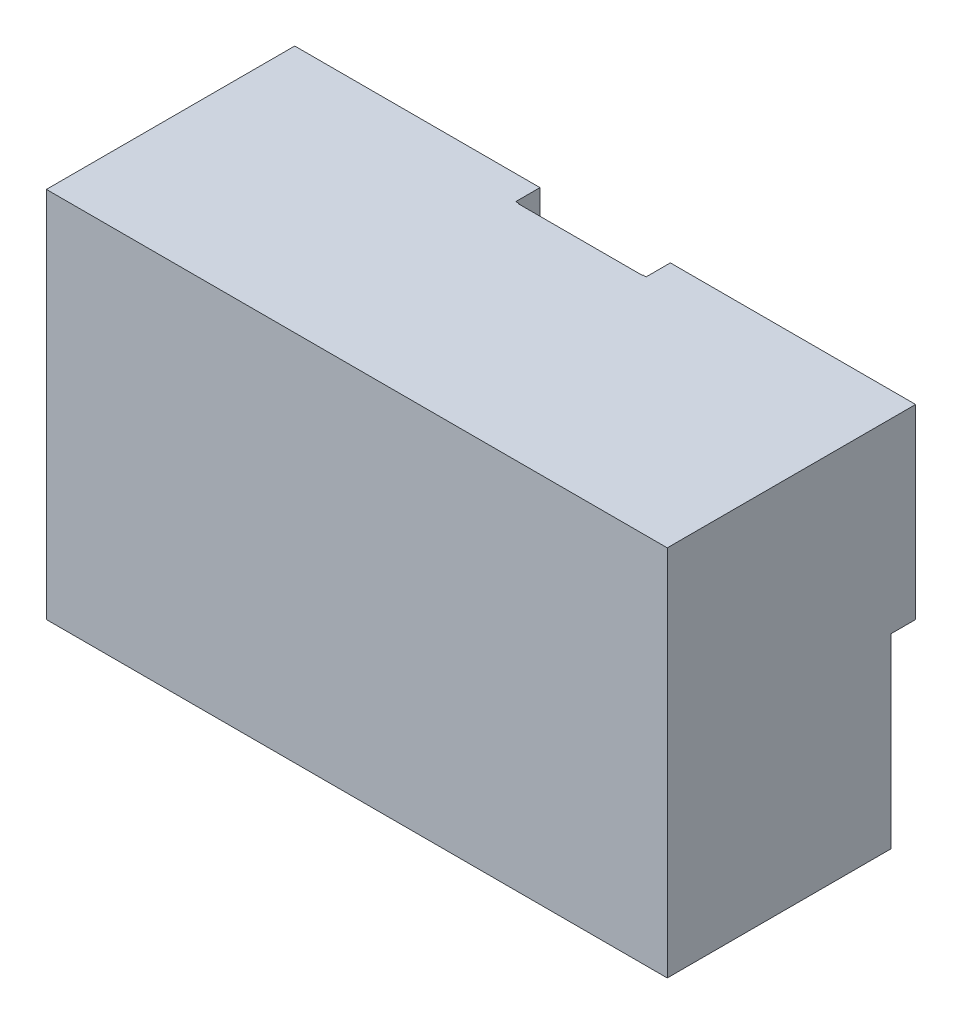
ISO-10303-21;
HEADER;
FILE_DESCRIPTION(('STEP AP214'),'2;1');
FILE_NAME('part.step','',(''),(''),'','','');
FILE_SCHEMA(('AUTOMOTIVE_DESIGN { 1 0 10303 214 1 1 1 1 }'));
ENDSEC;
DATA;
#1=APPLICATION_CONTEXT('core data for automotive mechanical design processes');
#2=APPLICATION_PROTOCOL_DEFINITION('international standard','automotive_design',2000,#1);
#3=PRODUCT_CONTEXT('',#1,'mechanical');
#4=PRODUCT('Part','Part','',(#3));
#5=PRODUCT_RELATED_PRODUCT_CATEGORY('part','',(#4));
#6=PRODUCT_DEFINITION_FORMATION('','',#4);
#7=PRODUCT_DEFINITION_CONTEXT('part definition',#1,'design');
#8=PRODUCT_DEFINITION('design','',#6,#7);
#9=PRODUCT_DEFINITION_SHAPE('','',#8);
#10=(LENGTH_UNIT() NAMED_UNIT(*) SI_UNIT(.MILLI.,.METRE.));
#11=(NAMED_UNIT(*) PLANE_ANGLE_UNIT() SI_UNIT($,.RADIAN.));
#12=(NAMED_UNIT(*) SI_UNIT($,.STERADIAN.) SOLID_ANGLE_UNIT());
#13=UNCERTAINTY_MEASURE_WITH_UNIT(LENGTH_MEASURE(1.E-05),#10,'distance_accuracy_value','');
#14=(GEOMETRIC_REPRESENTATION_CONTEXT(3) GLOBAL_UNCERTAINTY_ASSIGNED_CONTEXT((#13)) GLOBAL_UNIT_ASSIGNED_CONTEXT((#10,
#11,#12)) REPRESENTATION_CONTEXT('',''));
#15=CARTESIAN_POINT('',(0.,0.,0.));
#16=DIRECTION('',(0.,0.,1.));
#17=DIRECTION('',(1.,0.,0.));
#18=AXIS2_PLACEMENT_3D('',#15,#16,#17);
#19=CARTESIAN_POINT('',(0.,0.,0.4));
#20=DIRECTION('',(0.,0.,1.));
#21=DIRECTION('',(1.,0.,0.));
#22=AXIS2_PLACEMENT_3D('',#19,#20,#21);
#23=PLANE('',#22);
#24=DIRECTION('',(0.,1.,0.));
#25=VECTOR('',#24,1.);
#26=CARTESIAN_POINT('',(-0.5,0.,0.4));
#27=LINE('',#26,#25);
#28=CARTESIAN_POINT('',(-0.5,0.3,0.4));
#29=VERTEX_POINT('',#28);
#30=CARTESIAN_POINT('',(-0.5,-0.3,0.4));
#31=VERTEX_POINT('',#30);
#32=EDGE_CURVE('E27',#29,#31,#27,.F.);
#33=ORIENTED_EDGE('',*,*,#32,.T.);
#34=DIRECTION('',(1.,0.,0.));
#35=VECTOR('',#34,1.);
#36=CARTESIAN_POINT('',(0.,-0.3,0.4));
#37=LINE('',#36,#35);
#38=CARTESIAN_POINT('',(0.5,-0.3,0.4));
#39=VERTEX_POINT('',#38);
#40=EDGE_CURVE('E11',#31,#39,#37,.T.);
#41=ORIENTED_EDGE('',*,*,#40,.T.);
#42=DIRECTION('',(0.,1.,0.));
#43=VECTOR('',#42,1.);
#44=CARTESIAN_POINT('',(0.5,0.,0.4));
#45=LINE('',#44,#43);
#46=CARTESIAN_POINT('',(0.5,0.3,0.4));
#47=VERTEX_POINT('',#46);
#48=EDGE_CURVE('E287',#39,#47,#45,.T.);
#49=ORIENTED_EDGE('',*,*,#48,.T.);
#50=DIRECTION('',(1.,0.,0.));
#51=VECTOR('',#50,1.);
#52=CARTESIAN_POINT('',(0.,0.3,0.4));
#53=LINE('',#52,#51);
#54=EDGE_CURVE('E284',#47,#29,#53,.F.);
#55=ORIENTED_EDGE('',*,*,#54,.T.);
#56=EDGE_LOOP('',(#33,#41,#49,#55));
#57=FACE_BOUND('',#56,.T.);
#58=ADVANCED_FACE('F17',(#57),#23,.T.);
#59=CARTESIAN_POINT('',(0.,-0.3,0.4));
#60=DIRECTION('',(0.,-1.,0.));
#61=DIRECTION('',(0.,0.,-1.));
#62=AXIS2_PLACEMENT_3D('',#59,#60,#61);
#63=PLANE('',#62);
#64=ORIENTED_EDGE('',*,*,#40,.F.);
#65=DIRECTION('',(0.,0.,-1.));
#66=VECTOR('',#65,1.);
#67=CARTESIAN_POINT('',(-0.5,-0.3,0.4));
#68=LINE('',#67,#66);
#69=CARTESIAN_POINT('',(-0.5,-0.3,0.04));
#70=VERTEX_POINT('',#69);
#71=EDGE_CURVE('E36',#31,#70,#68,.T.);
#72=ORIENTED_EDGE('',*,*,#71,.T.);
#73=DIRECTION('',(1.,0.,0.));
#74=VECTOR('',#73,1.);
#75=CARTESIAN_POINT('',(0.,-0.3,0.04));
#76=LINE('',#75,#74);
#77=CARTESIAN_POINT('',(-0.245,-0.3,0.04));
#78=VERTEX_POINT('',#77);
#79=EDGE_CURVE('E522',#70,#78,#76,.T.);
#80=ORIENTED_EDGE('',*,*,#79,.T.);
#81=DIRECTION('',(0.,0.,-1.));
#82=VECTOR('',#81,1.);
#83=CARTESIAN_POINT('',(-0.245,-0.3,0.4));
#84=LINE('',#83,#82);
#85=CARTESIAN_POINT('',(-0.245,-0.3,0.));
#86=VERTEX_POINT('',#85);
#87=EDGE_CURVE('E380',#78,#86,#84,.T.);
#88=ORIENTED_EDGE('',*,*,#87,.T.);
#89=DIRECTION('',(1.,0.,0.));
#90=VECTOR('',#89,1.);
#91=CARTESIAN_POINT('',(0.,-0.3,0.));
#92=LINE('',#91,#90);
#93=CARTESIAN_POINT('',(0.25,-0.3,0.));
#94=VERTEX_POINT('',#93);
#95=EDGE_CURVE('E375',#86,#94,#92,.T.);
#96=ORIENTED_EDGE('',*,*,#95,.T.);
#97=DIRECTION('',(0.,0.,-1.));
#98=VECTOR('',#97,1.);
#99=CARTESIAN_POINT('',(0.25,-0.3,0.4));
#100=LINE('',#99,#98);
#101=CARTESIAN_POINT('',(0.25,-0.3,0.04));
#102=VERTEX_POINT('',#101);
#103=EDGE_CURVE('E333',#94,#102,#100,.F.);
#104=ORIENTED_EDGE('',*,*,#103,.T.);
#105=DIRECTION('',(1.,0.,0.));
#106=VECTOR('',#105,1.);
#107=CARTESIAN_POINT('',(0.,-0.3,0.04));
#108=LINE('',#107,#106);
#109=CARTESIAN_POINT('',(0.5,-0.3,0.04));
#110=VERTEX_POINT('',#109);
#111=EDGE_CURVE('E328',#102,#110,#108,.T.);
#112=ORIENTED_EDGE('',*,*,#111,.T.);
#113=DIRECTION('',(0.,0.,-1.));
#114=VECTOR('',#113,1.);
#115=CARTESIAN_POINT('',(0.5,-0.3,0.4));
#116=LINE('',#115,#114);
#117=EDGE_CURVE('E325',#110,#39,#116,.F.);
#118=ORIENTED_EDGE('',*,*,#117,.T.);
#119=EDGE_LOOP('',(#64,#72,#80,#88,#96,#104,#112,#118));
#120=FACE_BOUND('',#119,.T.);
#121=ADVANCED_FACE('F553',(#120),#63,.T.);
#122=CARTESIAN_POINT('',(-0.5,0.,0.4));
#123=DIRECTION('',(-1.,0.,0.));
#124=DIRECTION('',(0.,0.,1.));
#125=AXIS2_PLACEMENT_3D('',#122,#123,#124);
#126=PLANE('',#125);
#127=DIRECTION('',(0.,0.,1.));
#128=VECTOR('',#127,1.);
#129=CARTESIAN_POINT('',(-0.5,0.3,0.4));
#130=LINE('',#129,#128);
#131=CARTESIAN_POINT('',(-0.5,0.3,0.));
#132=VERTEX_POINT('',#131);
#133=EDGE_CURVE('E516',#29,#132,#130,.F.);
#134=ORIENTED_EDGE('',*,*,#133,.T.);
#135=DIRECTION('',(0.,1.,0.));
#136=VECTOR('',#135,1.);
#137=CARTESIAN_POINT('',(-0.5,0.,0.));
#138=LINE('',#137,#136);
#139=CARTESIAN_POINT('',(-0.5,0.005,0.));
#140=VERTEX_POINT('',#139);
#141=EDGE_CURVE('E519',#132,#140,#138,.F.);
#142=ORIENTED_EDGE('',*,*,#141,.T.);
#143=DIRECTION('',(0.,0.,1.));
#144=VECTOR('',#143,1.);
#145=CARTESIAN_POINT('',(-0.5,0.005,0.4));
#146=LINE('',#145,#144);
#147=CARTESIAN_POINT('',(-0.5,0.005,0.04));
#148=VERTEX_POINT('',#147);
#149=EDGE_CURVE('E466',#140,#148,#146,.T.);
#150=ORIENTED_EDGE('',*,*,#149,.T.);
#151=DIRECTION('',(0.,1.,0.));
#152=VECTOR('',#151,1.);
#153=CARTESIAN_POINT('',(-0.5,0.,0.04));
#154=LINE('',#153,#152);
#155=EDGE_CURVE('E514',#148,#70,#154,.F.);
#156=ORIENTED_EDGE('',*,*,#155,.T.);
#157=ORIENTED_EDGE('',*,*,#71,.F.);
#158=ORIENTED_EDGE('',*,*,#32,.F.);
#159=EDGE_LOOP('',(#134,#142,#150,#156,#157,#158));
#160=FACE_BOUND('',#159,.T.);
#161=ADVANCED_FACE('F531',(#160),#126,.T.);
#162=CARTESIAN_POINT('',(0.,0.3,0.4));
#163=DIRECTION('',(0.,1.,0.));
#164=DIRECTION('',(0.,0.,1.));
#165=AXIS2_PLACEMENT_3D('',#162,#163,#164);
#166=PLANE('',#165);
#167=DIRECTION('',(1.,0.,0.));
#168=VECTOR('',#167,1.);
#169=CARTESIAN_POINT('',(0.,0.3,0.04));
#170=LINE('',#169,#168);
#171=CARTESIAN_POINT('',(0.1,0.3,0.04));
#172=VERTEX_POINT('',#171);
#173=CARTESIAN_POINT('',(-0.1,0.3,0.04));
#174=VERTEX_POINT('',#173);
#175=EDGE_CURVE('E467',#172,#174,#170,.F.);
#176=ORIENTED_EDGE('',*,*,#175,.T.);
#177=DIRECTION('',(0.,0.,1.));
#178=VECTOR('',#177,1.);
#179=CARTESIAN_POINT('',(-0.1,0.3,0.4));
#180=LINE('',#179,#178);
#181=CARTESIAN_POINT('',(-0.1,0.3,0.039));
#182=VERTEX_POINT('',#181);
#183=EDGE_CURVE('E463',#174,#182,#180,.F.);
#184=ORIENTED_EDGE('',*,*,#183,.T.);
#185=DIRECTION('',(1.,0.,0.));
#186=VECTOR('',#185,1.);
#187=CARTESIAN_POINT('',(0.,0.3,0.039));
#188=LINE('',#187,#186);
#189=CARTESIAN_POINT('',(-0.105,0.3,0.039));
#190=VERTEX_POINT('',#189);
#191=EDGE_CURVE('E280',#182,#190,#188,.F.);
#192=ORIENTED_EDGE('',*,*,#191,.T.);
#193=DIRECTION('',(0.,0.,1.));
#194=VECTOR('',#193,1.);
#195=CARTESIAN_POINT('',(-0.105,0.3,0.4));
#196=LINE('',#195,#194);
#197=CARTESIAN_POINT('',(-0.105,0.3,0.));
#198=VERTEX_POINT('',#197);
#199=EDGE_CURVE('E300',#190,#198,#196,.F.);
#200=ORIENTED_EDGE('',*,*,#199,.T.);
#201=DIRECTION('',(1.,0.,0.));
#202=VECTOR('',#201,1.);
#203=CARTESIAN_POINT('',(0.,0.3,0.));
#204=LINE('',#203,#202);
#205=EDGE_CURVE('E275',#198,#132,#204,.F.);
#206=ORIENTED_EDGE('',*,*,#205,.T.);
#207=ORIENTED_EDGE('',*,*,#133,.F.);
#208=ORIENTED_EDGE('',*,*,#54,.F.);
#209=DIRECTION('',(0.,0.,1.));
#210=VECTOR('',#209,1.);
#211=CARTESIAN_POINT('',(0.5,0.3,0.4));
#212=LINE('',#211,#210);
#213=CARTESIAN_POINT('',(0.5,0.3,0.));
#214=VERTEX_POINT('',#213);
#215=EDGE_CURVE('E263',#47,#214,#212,.F.);
#216=ORIENTED_EDGE('',*,*,#215,.T.);
#217=DIRECTION('',(1.,0.,0.));
#218=VECTOR('',#217,1.);
#219=CARTESIAN_POINT('',(0.,0.3,0.));
#220=LINE('',#219,#218);
#221=CARTESIAN_POINT('',(0.105,0.3,0.));
#222=VERTEX_POINT('',#221);
#223=EDGE_CURVE('E258',#214,#222,#220,.F.);
#224=ORIENTED_EDGE('',*,*,#223,.T.);
#225=DIRECTION('',(0.,0.,1.));
#226=VECTOR('',#225,1.);
#227=CARTESIAN_POINT('',(0.105,0.3,0.4));
#228=LINE('',#227,#226);
#229=CARTESIAN_POINT('',(0.105,0.3,0.039));
#230=VERTEX_POINT('',#229);
#231=EDGE_CURVE('E254',#222,#230,#228,.T.);
#232=ORIENTED_EDGE('',*,*,#231,.T.);
#233=DIRECTION('',(1.,0.,0.));
#234=VECTOR('',#233,1.);
#235=CARTESIAN_POINT('',(0.,0.3,0.039));
#236=LINE('',#235,#234);
#237=CARTESIAN_POINT('',(0.1,0.3,0.039));
#238=VERTEX_POINT('',#237);
#239=EDGE_CURVE('E257',#230,#238,#236,.F.);
#240=ORIENTED_EDGE('',*,*,#239,.T.);
#241=DIRECTION('',(0.,0.,1.));
#242=VECTOR('',#241,1.);
#243=CARTESIAN_POINT('',(0.1,0.3,0.4));
#244=LINE('',#243,#242);
#245=EDGE_CURVE('E242',#238,#172,#244,.T.);
#246=ORIENTED_EDGE('',*,*,#245,.T.);
#247=EDGE_LOOP('',(#176,#184,#192,#200,#206,#207,#208,#216,#224,#232,#240,#246));
#248=FACE_BOUND('',#247,.T.);
#249=ADVANCED_FACE('F534',(#248),#166,.T.);
#250=CARTESIAN_POINT('',(0.5,0.,0.4));
#251=DIRECTION('',(1.,0.,0.));
#252=DIRECTION('',(0.,0.,-1.));
#253=AXIS2_PLACEMENT_3D('',#250,#251,#252);
#254=PLANE('',#253);
#255=ORIENTED_EDGE('',*,*,#48,.F.);
#256=ORIENTED_EDGE('',*,*,#117,.F.);
#257=DIRECTION('',(0.,1.,0.));
#258=VECTOR('',#257,1.);
#259=CARTESIAN_POINT('',(0.5,0.,0.04));
#260=LINE('',#259,#258);
#261=CARTESIAN_POINT('',(0.5,0.,0.04));
#262=VERTEX_POINT('',#261);
#263=EDGE_CURVE('E311',#110,#262,#260,.T.);
#264=ORIENTED_EDGE('',*,*,#263,.T.);
#265=DIRECTION('',(0.,0.,-1.));
#266=VECTOR('',#265,1.);
#267=CARTESIAN_POINT('',(0.5,0.,0.4));
#268=LINE('',#267,#266);
#269=CARTESIAN_POINT('',(0.5,0.,0.));
#270=VERTEX_POINT('',#269);
#271=EDGE_CURVE('E281',#262,#270,#268,.T.);
#272=ORIENTED_EDGE('',*,*,#271,.T.);
#273=DIRECTION('',(0.,1.,0.));
#274=VECTOR('',#273,1.);
#275=CARTESIAN_POINT('',(0.5,0.,0.));
#276=LINE('',#275,#274);
#277=EDGE_CURVE('E278',#270,#214,#276,.T.);
#278=ORIENTED_EDGE('',*,*,#277,.T.);
#279=ORIENTED_EDGE('',*,*,#215,.F.);
#280=EDGE_LOOP('',(#255,#256,#264,#272,#278,#279));
#281=FACE_BOUND('',#280,.T.);
#282=ADVANCED_FACE('F557',(#281),#254,.T.);
#283=CARTESIAN_POINT('',(0.,0.,0.04));
#284=DIRECTION('',(0.,0.,1.));
#285=DIRECTION('',(1.,0.,0.));
#286=AXIS2_PLACEMENT_3D('',#283,#284,#285);
#287=PLANE('',#286);
#288=DIRECTION('',(1.,0.,0.));
#289=VECTOR('',#288,1.);
#290=CARTESIAN_POINT('',(0.,-0.005,0.04));
#291=LINE('',#290,#289);
#292=CARTESIAN_POINT('',(0.255,-0.00500000000000001,0.04));
#293=VERTEX_POINT('',#292);
#294=CARTESIAN_POINT('',(0.45,-0.005,0.04));
#295=VERTEX_POINT('',#294);
#296=EDGE_CURVE('E498',#293,#295,#291,.T.);
#297=ORIENTED_EDGE('',*,*,#296,.F.);
#298=DIRECTION('',(0.,1.,0.));
#299=VECTOR('',#298,1.);
#300=CARTESIAN_POINT('',(0.255,0.,0.04));
#301=LINE('',#300,#299);
#302=CARTESIAN_POINT('',(0.255,-0.25,0.04));
#303=VERTEX_POINT('',#302);
#304=EDGE_CURVE('E496',#303,#293,#301,.T.);
#305=ORIENTED_EDGE('',*,*,#304,.F.);
#306=DIRECTION('',(1.,0.,0.));
#307=VECTOR('',#306,1.);
#308=CARTESIAN_POINT('',(0.,-0.25,0.04));
#309=LINE('',#308,#307);
#310=CARTESIAN_POINT('',(0.45,-0.25,0.04));
#311=VERTEX_POINT('',#310);
#312=EDGE_CURVE('E366',#311,#303,#309,.F.);
#313=ORIENTED_EDGE('',*,*,#312,.F.);
#314=DIRECTION('',(0.,1.,0.));
#315=VECTOR('',#314,1.);
#316=CARTESIAN_POINT('',(0.45,0.,0.04));
#317=LINE('',#316,#315);
#318=EDGE_CURVE('E316',#295,#311,#317,.F.);
#319=ORIENTED_EDGE('',*,*,#318,.F.);
#320=EDGE_LOOP('',(#297,#305,#313,#319));
#321=FACE_BOUND('',#320,.T.);
#322=DIRECTION('',(1.,0.,0.));
#323=VECTOR('',#322,1.);
#324=CARTESIAN_POINT('',(0.,0.,0.04));
#325=LINE('',#324,#323);
#326=CARTESIAN_POINT('',(0.25,0.,0.04));
#327=VERTEX_POINT('',#326);
#328=EDGE_CURVE('E319',#262,#327,#325,.F.);
#329=ORIENTED_EDGE('',*,*,#328,.F.);
#330=ORIENTED_EDGE('',*,*,#263,.F.);
#331=ORIENTED_EDGE('',*,*,#111,.F.);
#332=DIRECTION('',(0.,1.,0.));
#333=VECTOR('',#332,1.);
#334=CARTESIAN_POINT('',(0.25,0.,0.04));
#335=LINE('',#334,#333);
#336=EDGE_CURVE('E321',#327,#102,#335,.F.);
#337=ORIENTED_EDGE('',*,*,#336,.F.);
#338=EDGE_LOOP('',(#329,#330,#331,#337));
#339=FACE_BOUND('',#338,.T.);
#340=ADVANCED_FACE('F594',(#321,#339),#287,.F.);
#341=CARTESIAN_POINT('',(0.25,-0.25,0.015));
#342=DIRECTION('',(1.,0.,0.));
#343=DIRECTION('',(0.,0.,-1.));
#344=AXIS2_PLACEMENT_3D('',#341,#342,#343);
#345=PLANE('',#344);
#346=ORIENTED_EDGE('',*,*,#336,.T.);
#347=ORIENTED_EDGE('',*,*,#103,.F.);
#348=DIRECTION('',(0.,1.,0.));
#349=VECTOR('',#348,1.);
#350=CARTESIAN_POINT('',(0.25,-0.25,0.));
#351=LINE('',#350,#349);
#352=CARTESIAN_POINT('',(0.25,0.,0.));
#353=VERTEX_POINT('',#352);
#354=EDGE_CURVE('E362',#94,#353,#351,.T.);
#355=ORIENTED_EDGE('',*,*,#354,.T.);
#356=DIRECTION('',(0.,0.,-1.));
#357=VECTOR('',#356,1.);
#358=CARTESIAN_POINT('',(0.25,0.,0.015));
#359=LINE('',#358,#357);
#360=EDGE_CURVE('E322',#353,#327,#359,.F.);
#361=ORIENTED_EDGE('',*,*,#360,.T.);
#362=EDGE_LOOP('',(#346,#347,#355,#361));
#363=FACE_BOUND('',#362,.T.);
#364=ADVANCED_FACE('F597',(#363),#345,.T.);
#365=CARTESIAN_POINT('',(0.,0.,0.));
#366=DIRECTION('',(0.,0.,1.));
#367=DIRECTION('',(1.,0.,0.));
#368=AXIS2_PLACEMENT_3D('',#365,#366,#367);
#369=PLANE('',#368);
#370=DIRECTION('',(0.,1.,0.));
#371=VECTOR('',#370,1.);
#372=CARTESIAN_POINT('',(0.105,0.,0.));
#373=LINE('',#372,#371);
#374=CARTESIAN_POINT('',(0.105,-0.005,0.));
#375=VERTEX_POINT('',#374);
#376=EDGE_CURVE('E266',#222,#375,#373,.F.);
#377=ORIENTED_EDGE('',*,*,#376,.F.);
#378=ORIENTED_EDGE('',*,*,#223,.F.);
#379=ORIENTED_EDGE('',*,*,#277,.F.);
#380=DIRECTION('',(1.,0.,0.));
#381=VECTOR('',#380,1.);
#382=CARTESIAN_POINT('',(0.,0.,0.));
#383=LINE('',#382,#381);
#384=EDGE_CURVE('E270',#353,#270,#383,.T.);
#385=ORIENTED_EDGE('',*,*,#384,.F.);
#386=ORIENTED_EDGE('',*,*,#354,.F.);
#387=ORIENTED_EDGE('',*,*,#95,.F.);
#388=DIRECTION('',(0.,1.,0.));
#389=VECTOR('',#388,1.);
#390=CARTESIAN_POINT('',(-0.245,0.,0.));
#391=LINE('',#390,#389);
#392=CARTESIAN_POINT('',(-0.245,0.005,0.));
#393=VERTEX_POINT('',#392);
#394=EDGE_CURVE('E306',#393,#86,#391,.F.);
#395=ORIENTED_EDGE('',*,*,#394,.F.);
#396=DIRECTION('',(1.,0.,0.));
#397=VECTOR('',#396,1.);
#398=CARTESIAN_POINT('',(0.,0.005,0.));
#399=LINE('',#398,#397);
#400=EDGE_CURVE('E445',#140,#393,#399,.T.);
#401=ORIENTED_EDGE('',*,*,#400,.F.);
#402=ORIENTED_EDGE('',*,*,#141,.F.);
#403=ORIENTED_EDGE('',*,*,#205,.F.);
#404=DIRECTION('',(0.,1.,0.));
#405=VECTOR('',#404,1.);
#406=CARTESIAN_POINT('',(-0.105,0.,0.));
#407=LINE('',#406,#405);
#408=CARTESIAN_POINT('',(-0.105,-0.00500000000000001,0.));
#409=VERTEX_POINT('',#408);
#410=EDGE_CURVE('E443',#409,#198,#407,.T.);
#411=ORIENTED_EDGE('',*,*,#410,.F.);
#412=DIRECTION('',(1.,0.,0.));
#413=VECTOR('',#412,1.);
#414=CARTESIAN_POINT('',(0.,-0.005,0.));
#415=LINE('',#414,#413);
#416=EDGE_CURVE('E269',#375,#409,#415,.F.);
#417=ORIENTED_EDGE('',*,*,#416,.F.);
#418=EDGE_LOOP('',(#377,#378,#379,#385,#386,#387,#395,#401,#402,#403,#411,#417));
#419=FACE_BOUND('',#418,.T.);
#420=ADVANCED_FACE('F540',(#419),#369,.F.);
#421=CARTESIAN_POINT('',(-0.245,-0.3,0.04));
#422=DIRECTION('',(-1.,0.,0.));
#423=DIRECTION('',(0.,0.,1.));
#424=AXIS2_PLACEMENT_3D('',#421,#422,#423);
#425=PLANE('',#424);
#426=DIRECTION('',(0.,1.,0.));
#427=VECTOR('',#426,1.);
#428=CARTESIAN_POINT('',(-0.245,-0.3,0.04));
#429=LINE('',#428,#427);
#430=CARTESIAN_POINT('',(-0.245,0.005,0.04));
#431=VERTEX_POINT('',#430);
#432=EDGE_CURVE('E488',#78,#431,#429,.T.);
#433=ORIENTED_EDGE('',*,*,#432,.T.);
#434=DIRECTION('',(0.,0.,1.));
#435=VECTOR('',#434,1.);
#436=CARTESIAN_POINT('',(-0.245,0.00500000000000001,0.04));
#437=LINE('',#436,#435);
#438=EDGE_CURVE('E446',#431,#393,#437,.F.);
#439=ORIENTED_EDGE('',*,*,#438,.T.);
#440=ORIENTED_EDGE('',*,*,#394,.T.);
#441=ORIENTED_EDGE('',*,*,#87,.F.);
#442=EDGE_LOOP('',(#433,#439,#440,#441));
#443=FACE_BOUND('',#442,.T.);
#444=ADVANCED_FACE('F547',(#443),#425,.T.);
#445=CARTESIAN_POINT('',(0.,0.,0.04));
#446=DIRECTION('',(0.,0.,1.));
#447=DIRECTION('',(1.,0.,0.));
#448=AXIS2_PLACEMENT_3D('',#445,#446,#447);
#449=PLANE('',#448);
#450=DIRECTION('',(0.,1.,0.));
#451=VECTOR('',#450,1.);
#452=CARTESIAN_POINT('',(-0.25,0.,0.04));
#453=LINE('',#452,#451);
#454=CARTESIAN_POINT('',(-0.25,0.,0.04));
#455=VERTEX_POINT('',#454);
#456=CARTESIAN_POINT('',(-0.25,-0.25,0.04));
#457=VERTEX_POINT('',#456);
#458=EDGE_CURVE('E483',#455,#457,#453,.F.);
#459=ORIENTED_EDGE('',*,*,#458,.F.);
#460=DIRECTION('',(1.,0.,0.));
#461=VECTOR('',#460,1.);
#462=CARTESIAN_POINT('',(0.,0.,0.04));
#463=LINE('',#462,#461);
#464=CARTESIAN_POINT('',(-0.45,0.,0.04));
#465=VERTEX_POINT('',#464);
#466=EDGE_CURVE('E481',#465,#455,#463,.T.);
#467=ORIENTED_EDGE('',*,*,#466,.F.);
#468=DIRECTION('',(0.,1.,0.));
#469=VECTOR('',#468,1.);
#470=CARTESIAN_POINT('',(-0.45,0.,0.04));
#471=LINE('',#470,#469);
#472=CARTESIAN_POINT('',(-0.45,-0.25,0.04));
#473=VERTEX_POINT('',#472);
#474=EDGE_CURVE('E473',#473,#465,#471,.T.);
#475=ORIENTED_EDGE('',*,*,#474,.F.);
#476=DIRECTION('',(1.,0.,0.));
#477=VECTOR('',#476,1.);
#478=CARTESIAN_POINT('',(0.,-0.25,0.04));
#479=LINE('',#478,#477);
#480=EDGE_CURVE('E485',#457,#473,#479,.F.);
#481=ORIENTED_EDGE('',*,*,#480,.F.);
#482=EDGE_LOOP('',(#459,#467,#475,#481));
#483=FACE_BOUND('',#482,.T.);
#484=ORIENTED_EDGE('',*,*,#79,.F.);
#485=ORIENTED_EDGE('',*,*,#155,.F.);
#486=DIRECTION('',(1.,0.,0.));
#487=VECTOR('',#486,1.);
#488=CARTESIAN_POINT('',(0.,0.005,0.04));
#489=LINE('',#488,#487);
#490=EDGE_CURVE('E469',#431,#148,#489,.F.);
#491=ORIENTED_EDGE('',*,*,#490,.F.);
#492=ORIENTED_EDGE('',*,*,#432,.F.);
#493=EDGE_LOOP('',(#484,#485,#491,#492));
#494=FACE_BOUND('',#493,.T.);
#495=ADVANCED_FACE('F550',(#483,#494),#449,.F.);
#496=CARTESIAN_POINT('',(0.,0.005,0.04));
#497=DIRECTION('',(0.,-1.,0.));
#498=DIRECTION('',(0.,0.,-1.));
#499=AXIS2_PLACEMENT_3D('',#496,#497,#498);
#500=PLANE('',#499);
#501=ORIENTED_EDGE('',*,*,#490,.T.);
#502=ORIENTED_EDGE('',*,*,#149,.F.);
#503=ORIENTED_EDGE('',*,*,#400,.T.);
#504=ORIENTED_EDGE('',*,*,#438,.F.);
#505=EDGE_LOOP('',(#501,#502,#503,#504));
#506=FACE_BOUND('',#505,.T.);
#507=ADVANCED_FACE('F545',(#506),#500,.T.);
#508=CARTESIAN_POINT('',(-0.1,0.3,0.015));
#509=DIRECTION('',(-1.,0.,0.));
#510=DIRECTION('',(0.,0.,1.));
#511=AXIS2_PLACEMENT_3D('',#508,#509,#510);
#512=PLANE('',#511);
#513=DIRECTION('',(0.,1.,0.));
#514=VECTOR('',#513,1.);
#515=CARTESIAN_POINT('',(-0.1,0.3,0.039));
#516=LINE('',#515,#514);
#517=CARTESIAN_POINT('',(-0.1,0.25,0.039));
#518=VERTEX_POINT('',#517);
#519=EDGE_CURVE('E470',#182,#518,#516,.F.);
#520=ORIENTED_EDGE('',*,*,#519,.F.);
#521=ORIENTED_EDGE('',*,*,#183,.F.);
#522=DIRECTION('',(0.,1.,0.));
#523=VECTOR('',#522,1.);
#524=CARTESIAN_POINT('',(-0.1,0.3,0.04));
#525=LINE('',#524,#523);
#526=CARTESIAN_POINT('',(-0.1,0.25,0.04));
#527=VERTEX_POINT('',#526);
#528=EDGE_CURVE('E476',#527,#174,#525,.T.);
#529=ORIENTED_EDGE('',*,*,#528,.F.);
#530=DIRECTION('',(0.,0.,-1.));
#531=VECTOR('',#530,1.);
#532=CARTESIAN_POINT('',(-0.1,0.25,0.04));
#533=LINE('',#532,#531);
#534=EDGE_CURVE('E468',#518,#527,#533,.F.);
#535=ORIENTED_EDGE('',*,*,#534,.F.);
#536=EDGE_LOOP('',(#520,#521,#529,#535));
#537=FACE_BOUND('',#536,.T.);
#538=ADVANCED_FACE('F571',(#537),#512,.F.);
#539=CARTESIAN_POINT('',(0.,0.,0.04));
#540=DIRECTION('',(0.,0.,1.));
#541=DIRECTION('',(1.,0.,0.));
#542=AXIS2_PLACEMENT_3D('',#539,#540,#541);
#543=PLANE('',#542);
#544=DIRECTION('',(1.,0.,0.));
#545=VECTOR('',#544,1.);
#546=CARTESIAN_POINT('',(0.,0.25,0.04));
#547=LINE('',#546,#545);
#548=CARTESIAN_POINT('',(0.1,0.25,0.04));
#549=VERTEX_POINT('',#548);
#550=EDGE_CURVE('E207',#527,#549,#547,.T.);
#551=ORIENTED_EDGE('',*,*,#550,.F.);
#552=ORIENTED_EDGE('',*,*,#528,.T.);
#553=ORIENTED_EDGE('',*,*,#175,.F.);
#554=DIRECTION('',(0.,1.,0.));
#555=VECTOR('',#554,1.);
#556=CARTESIAN_POINT('',(0.1,0.,0.04));
#557=LINE('',#556,#555);
#558=EDGE_CURVE('E245',#549,#172,#557,.T.);
#559=ORIENTED_EDGE('',*,*,#558,.F.);
#560=EDGE_LOOP('',(#551,#552,#553,#559));
#561=FACE_BOUND('',#560,.T.);
#562=ADVANCED_FACE('F569',(#561),#543,.F.);
#563=CARTESIAN_POINT('',(0.1,0.3,0.015));
#564=DIRECTION('',(1.,0.,0.));
#565=DIRECTION('',(0.,0.,-1.));
#566=AXIS2_PLACEMENT_3D('',#563,#564,#565);
#567=PLANE('',#566);
#568=DIRECTION('',(0.,1.,0.));
#569=VECTOR('',#568,1.);
#570=CARTESIAN_POINT('',(0.1,0.3,0.039));
#571=LINE('',#570,#569);
#572=CARTESIAN_POINT('',(0.1,0.25,0.039));
#573=VERTEX_POINT('',#572);
#574=EDGE_CURVE('E229',#573,#238,#571,.T.);
#575=ORIENTED_EDGE('',*,*,#574,.F.);
#576=DIRECTION('',(0.,0.,-1.));
#577=VECTOR('',#576,1.);
#578=CARTESIAN_POINT('',(0.1,0.25,0.04));
#579=LINE('',#578,#577);
#580=EDGE_CURVE('E21',#549,#573,#579,.T.);
#581=ORIENTED_EDGE('',*,*,#580,.F.);
#582=ORIENTED_EDGE('',*,*,#558,.T.);
#583=ORIENTED_EDGE('',*,*,#245,.F.);
#584=EDGE_LOOP('',(#575,#581,#582,#583));
#585=FACE_BOUND('',#584,.T.);
#586=ADVANCED_FACE('F240',(#585),#567,.F.);
#587=CARTESIAN_POINT('',(0.,0.,0.039));
#588=DIRECTION('',(0.,0.,1.));
#589=DIRECTION('',(1.,0.,0.));
#590=AXIS2_PLACEMENT_3D('',#587,#588,#589);
#591=PLANE('',#590);
#592=ORIENTED_EDGE('',*,*,#239,.F.);
#593=DIRECTION('',(0.,1.,0.));
#594=VECTOR('',#593,1.);
#595=CARTESIAN_POINT('',(0.105,0.,0.039));
#596=LINE('',#595,#594);
#597=CARTESIAN_POINT('',(0.105,-0.005,0.039));
#598=VERTEX_POINT('',#597);
#599=EDGE_CURVE('E230',#598,#230,#596,.T.);
#600=ORIENTED_EDGE('',*,*,#599,.F.);
#601=DIRECTION('',(1.,0.,0.));
#602=VECTOR('',#601,1.);
#603=CARTESIAN_POINT('',(0.,-0.005,0.039));
#604=LINE('',#603,#602);
#605=CARTESIAN_POINT('',(-0.105,-0.005,0.039));
#606=VERTEX_POINT('',#605);
#607=EDGE_CURVE('E251',#606,#598,#604,.T.);
#608=ORIENTED_EDGE('',*,*,#607,.F.);
#609=DIRECTION('',(0.,1.,0.));
#610=VECTOR('',#609,1.);
#611=CARTESIAN_POINT('',(-0.105,0.,0.039));
#612=LINE('',#611,#610);
#613=EDGE_CURVE('E294',#190,#606,#612,.F.);
#614=ORIENTED_EDGE('',*,*,#613,.F.);
#615=ORIENTED_EDGE('',*,*,#191,.F.);
#616=ORIENTED_EDGE('',*,*,#519,.T.);
#617=DIRECTION('',(0.,1.,0.));
#618=VECTOR('',#617,1.);
#619=CARTESIAN_POINT('',(-0.1,0.,0.039));
#620=LINE('',#619,#618);
#621=CARTESIAN_POINT('',(-0.1,0.,0.039));
#622=VERTEX_POINT('',#621);
#623=EDGE_CURVE('E297',#622,#518,#620,.T.);
#624=ORIENTED_EDGE('',*,*,#623,.F.);
#625=DIRECTION('',(1.,0.,0.));
#626=VECTOR('',#625,1.);
#627=CARTESIAN_POINT('',(0.,0.,0.039));
#628=LINE('',#627,#626);
#629=CARTESIAN_POINT('',(0.1,0.,0.039));
#630=VERTEX_POINT('',#629);
#631=EDGE_CURVE('E237',#630,#622,#628,.F.);
#632=ORIENTED_EDGE('',*,*,#631,.F.);
#633=DIRECTION('',(0.,1.,0.));
#634=VECTOR('',#633,1.);
#635=CARTESIAN_POINT('',(0.1,0.,0.039));
#636=LINE('',#635,#634);
#637=EDGE_CURVE('E216',#573,#630,#636,.F.);
#638=ORIENTED_EDGE('',*,*,#637,.F.);
#639=ORIENTED_EDGE('',*,*,#574,.T.);
#640=EDGE_LOOP('',(#592,#600,#608,#614,#615,#616,#624,#632,#638,#639));
#641=FACE_BOUND('',#640,.T.);
#642=ADVANCED_FACE('F234',(#641),#591,.F.);
#643=CARTESIAN_POINT('',(0.105,0.15,0.039));
#644=DIRECTION('',(-1.,0.,0.));
#645=DIRECTION('',(0.,0.,1.));
#646=AXIS2_PLACEMENT_3D('',#643,#644,#645);
#647=PLANE('',#646);
#648=ORIENTED_EDGE('',*,*,#599,.T.);
#649=ORIENTED_EDGE('',*,*,#231,.F.);
#650=ORIENTED_EDGE('',*,*,#376,.T.);
#651=DIRECTION('',(0.,0.,1.));
#652=VECTOR('',#651,1.);
#653=CARTESIAN_POINT('',(0.105,-0.00500000000000001,0.039));
#654=LINE('',#653,#652);
#655=EDGE_CURVE('E238',#375,#598,#654,.T.);
#656=ORIENTED_EDGE('',*,*,#655,.T.);
#657=EDGE_LOOP('',(#648,#649,#650,#656));
#658=FACE_BOUND('',#657,.T.);
#659=ADVANCED_FACE('F563',(#658),#647,.T.);
#660=CARTESIAN_POINT('',(-0.105,0.15,0.039));
#661=DIRECTION('',(1.,0.,0.));
#662=DIRECTION('',(0.,0.,-1.));
#663=AXIS2_PLACEMENT_3D('',#660,#661,#662);
#664=PLANE('',#663);
#665=ORIENTED_EDGE('',*,*,#613,.T.);
#666=DIRECTION('',(0.,0.,-1.));
#667=VECTOR('',#666,1.);
#668=CARTESIAN_POINT('',(-0.105,-0.00500000000000001,0.039));
#669=LINE('',#668,#667);
#670=EDGE_CURVE('E339',#606,#409,#669,.T.);
#671=ORIENTED_EDGE('',*,*,#670,.T.);
#672=ORIENTED_EDGE('',*,*,#410,.T.);
#673=ORIENTED_EDGE('',*,*,#199,.F.);
#674=EDGE_LOOP('',(#665,#671,#672,#673));
#675=FACE_BOUND('',#674,.T.);
#676=ADVANCED_FACE('F832',(#675),#664,.T.);
#677=CARTESIAN_POINT('',(0.1,0.,0.015));
#678=DIRECTION('',(0.,-1.,0.));
#679=DIRECTION('',(0.,0.,-1.));
#680=AXIS2_PLACEMENT_3D('',#677,#678,#679);
#681=PLANE('',#680);
#682=ORIENTED_EDGE('',*,*,#384,.T.);
#683=ORIENTED_EDGE('',*,*,#271,.F.);
#684=ORIENTED_EDGE('',*,*,#328,.T.);
#685=ORIENTED_EDGE('',*,*,#360,.F.);
#686=EDGE_LOOP('',(#682,#683,#684,#685));
#687=FACE_BOUND('',#686,.T.);
#688=ADVANCED_FACE('F724',(#687),#681,.T.);
#689=CARTESIAN_POINT('',(0.45,-0.25,0.04));
#690=DIRECTION('',(-1.,0.,0.));
#691=DIRECTION('',(0.,0.,1.));
#692=AXIS2_PLACEMENT_3D('',#689,#690,#691);
#693=PLANE('',#692);
#694=ORIENTED_EDGE('',*,*,#318,.T.);
#695=DIRECTION('',(0.,0.,1.));
#696=VECTOR('',#695,1.);
#697=CARTESIAN_POINT('',(0.45,-0.25,0.04));
#698=LINE('',#697,#696);
#699=CARTESIAN_POINT('',(0.45,-0.25,0.015));
#700=VERTEX_POINT('',#699);
#701=EDGE_CURVE('E340',#700,#311,#698,.T.);
#702=ORIENTED_EDGE('',*,*,#701,.F.);
#703=DIRECTION('',(0.,1.,0.));
#704=VECTOR('',#703,1.);
#705=CARTESIAN_POINT('',(0.45,-0.25,0.015));
#706=LINE('',#705,#704);
#707=CARTESIAN_POINT('',(0.45,-0.005,0.015));
#708=VERTEX_POINT('',#707);
#709=EDGE_CURVE('E342',#708,#700,#706,.F.);
#710=ORIENTED_EDGE('',*,*,#709,.F.);
#711=DIRECTION('',(0.,0.,1.));
#712=VECTOR('',#711,1.);
#713=CARTESIAN_POINT('',(0.45,-0.00500000000000001,0.04));
#714=LINE('',#713,#712);
#715=EDGE_CURVE('E336',#295,#708,#714,.F.);
#716=ORIENTED_EDGE('',*,*,#715,.F.);
#717=EDGE_LOOP('',(#694,#702,#710,#716));
#718=FACE_BOUND('',#717,.T.);
#719=ADVANCED_FACE('F718',(#718),#693,.F.);
#720=CARTESIAN_POINT('',(0.,-0.005,0.04));
#721=DIRECTION('',(0.,1.,0.));
#722=DIRECTION('',(0.,0.,1.));
#723=AXIS2_PLACEMENT_3D('',#720,#721,#722);
#724=PLANE('',#723);
#725=ORIENTED_EDGE('',*,*,#296,.T.);
#726=ORIENTED_EDGE('',*,*,#715,.T.);
#727=DIRECTION('',(1.,0.,0.));
#728=VECTOR('',#727,1.);
#729=CARTESIAN_POINT('',(0.,-0.005,0.015));
#730=LINE('',#729,#728);
#731=CARTESIAN_POINT('',(0.255,-0.005,0.015));
#732=VERTEX_POINT('',#731);
#733=EDGE_CURVE('E347',#708,#732,#730,.F.);
#734=ORIENTED_EDGE('',*,*,#733,.T.);
#735=DIRECTION('',(0.,0.,1.));
#736=VECTOR('',#735,1.);
#737=CARTESIAN_POINT('',(0.255,-0.005,0.04));
#738=LINE('',#737,#736);
#739=EDGE_CURVE('E344',#732,#293,#738,.T.);
#740=ORIENTED_EDGE('',*,*,#739,.T.);
#741=EDGE_LOOP('',(#725,#726,#734,#740));
#742=FACE_BOUND('',#741,.T.);
#743=ADVANCED_FACE('F723',(#742),#724,.T.);
#744=CARTESIAN_POINT('',(0.255,-0.3,0.04));
#745=DIRECTION('',(-1.,0.,0.));
#746=DIRECTION('',(0.,0.,1.));
#747=AXIS2_PLACEMENT_3D('',#744,#745,#746);
#748=PLANE('',#747);
#749=ORIENTED_EDGE('',*,*,#304,.T.);
#750=ORIENTED_EDGE('',*,*,#739,.F.);
#751=DIRECTION('',(0.,1.,0.));
#752=VECTOR('',#751,1.);
#753=CARTESIAN_POINT('',(0.255,-0.3,0.015));
#754=LINE('',#753,#752);
#755=CARTESIAN_POINT('',(0.255,-0.25,0.015));
#756=VERTEX_POINT('',#755);
#757=EDGE_CURVE('E353',#732,#756,#754,.F.);
#758=ORIENTED_EDGE('',*,*,#757,.T.);
#759=DIRECTION('',(0.,0.,1.));
#760=VECTOR('',#759,1.);
#761=CARTESIAN_POINT('',(0.255,-0.25,0.04));
#762=LINE('',#761,#760);
#763=EDGE_CURVE('E350',#756,#303,#762,.T.);
#764=ORIENTED_EDGE('',*,*,#763,.T.);
#765=EDGE_LOOP('',(#749,#750,#758,#764));
#766=FACE_BOUND('',#765,.T.);
#767=ADVANCED_FACE('F710',(#766),#748,.T.);
#768=CARTESIAN_POINT('',(0.125,-0.25,0.04));
#769=DIRECTION('',(0.,-1.,0.));
#770=DIRECTION('',(0.,0.,-1.));
#771=AXIS2_PLACEMENT_3D('',#768,#769,#770);
#772=PLANE('',#771);
#773=DIRECTION('',(1.,0.,0.));
#774=VECTOR('',#773,1.);
#775=CARTESIAN_POINT('',(0.125,-0.25,0.015));
#776=LINE('',#775,#774);
#777=EDGE_CURVE('E356',#756,#700,#776,.T.);
#778=ORIENTED_EDGE('',*,*,#777,.T.);
#779=ORIENTED_EDGE('',*,*,#701,.T.);
#780=ORIENTED_EDGE('',*,*,#312,.T.);
#781=ORIENTED_EDGE('',*,*,#763,.F.);
#782=EDGE_LOOP('',(#778,#779,#780,#781));
#783=FACE_BOUND('',#782,.T.);
#784=ADVANCED_FACE('F705',(#783),#772,.T.);
#785=CARTESIAN_POINT('',(0.,-0.005,0.039));
#786=DIRECTION('',(0.,1.,0.));
#787=DIRECTION('',(0.,0.,1.));
#788=AXIS2_PLACEMENT_3D('',#785,#786,#787);
#789=PLANE('',#788);
#790=ORIENTED_EDGE('',*,*,#607,.T.);
#791=ORIENTED_EDGE('',*,*,#655,.F.);
#792=ORIENTED_EDGE('',*,*,#416,.T.);
#793=ORIENTED_EDGE('',*,*,#670,.F.);
#794=EDGE_LOOP('',(#790,#791,#792,#793));
#795=FACE_BOUND('',#794,.T.);
#796=ADVANCED_FACE('F696',(#795),#789,.T.);
#797=CARTESIAN_POINT('',(0.125,-0.25,0.04));
#798=DIRECTION('',(0.,-1.,0.));
#799=DIRECTION('',(0.,0.,-1.));
#800=AXIS2_PLACEMENT_3D('',#797,#798,#799);
#801=PLANE('',#800);
#802=DIRECTION('',(0.,0.,-1.));
#803=VECTOR('',#802,1.);
#804=CARTESIAN_POINT('',(-0.45,-0.25,0.04));
#805=LINE('',#804,#803);
#806=CARTESIAN_POINT('',(-0.45,-0.25,0.015));
#807=VERTEX_POINT('',#806);
#808=EDGE_CURVE('E393',#473,#807,#805,.T.);
#809=ORIENTED_EDGE('',*,*,#808,.T.);
#810=DIRECTION('',(1.,0.,0.));
#811=VECTOR('',#810,1.);
#812=CARTESIAN_POINT('',(0.125,-0.25,0.015));
#813=LINE('',#812,#811);
#814=CARTESIAN_POINT('',(-0.25,-0.25,0.015));
#815=VERTEX_POINT('',#814);
#816=EDGE_CURVE('E359',#807,#815,#813,.T.);
#817=ORIENTED_EDGE('',*,*,#816,.T.);
#818=DIRECTION('',(0.,0.,-1.));
#819=VECTOR('',#818,1.);
#820=CARTESIAN_POINT('',(-0.25,-0.25,0.04));
#821=LINE('',#820,#819);
#822=EDGE_CURVE('E396',#815,#457,#821,.F.);
#823=ORIENTED_EDGE('',*,*,#822,.T.);
#824=ORIENTED_EDGE('',*,*,#480,.T.);
#825=EDGE_LOOP('',(#809,#817,#823,#824));
#826=FACE_BOUND('',#825,.T.);
#827=ADVANCED_FACE('F619',(#826),#801,.T.);
#828=CARTESIAN_POINT('',(-0.25,-0.125,0.04));
#829=DIRECTION('',(1.,0.,0.));
#830=DIRECTION('',(0.,0.,-1.));
#831=AXIS2_PLACEMENT_3D('',#828,#829,#830);
#832=PLANE('',#831);
#833=DIRECTION('',(0.,0.,-1.));
#834=VECTOR('',#833,1.);
#835=CARTESIAN_POINT('',(-0.25,0.,0.04));
#836=LINE('',#835,#834);
#837=CARTESIAN_POINT('',(-0.25,0.,0.015));
#838=VERTEX_POINT('',#837);
#839=EDGE_CURVE('E399',#838,#455,#836,.F.);
#840=ORIENTED_EDGE('',*,*,#839,.T.);
#841=ORIENTED_EDGE('',*,*,#458,.T.);
#842=ORIENTED_EDGE('',*,*,#822,.F.);
#843=DIRECTION('',(0.,1.,0.));
#844=VECTOR('',#843,1.);
#845=CARTESIAN_POINT('',(-0.25,-0.125,0.015));
#846=LINE('',#845,#844);
#847=EDGE_CURVE('E402',#815,#838,#846,.T.);
#848=ORIENTED_EDGE('',*,*,#847,.T.);
#849=EDGE_LOOP('',(#840,#841,#842,#848));
#850=FACE_BOUND('',#849,.T.);
#851=ADVANCED_FACE('F616',(#850),#832,.T.);
#852=CARTESIAN_POINT('',(0.1,0.,0.04));
#853=DIRECTION('',(0.,-1.,0.));
#854=DIRECTION('',(0.,0.,-1.));
#855=AXIS2_PLACEMENT_3D('',#852,#853,#854);
#856=PLANE('',#855);
#857=DIRECTION('',(0.,0.,-1.));
#858=VECTOR('',#857,1.);
#859=CARTESIAN_POINT('',(-0.45,0.,0.04));
#860=LINE('',#859,#858);
#861=CARTESIAN_POINT('',(-0.45,0.,0.015));
#862=VERTEX_POINT('',#861);
#863=EDGE_CURVE('E407',#465,#862,#860,.T.);
#864=ORIENTED_EDGE('',*,*,#863,.F.);
#865=ORIENTED_EDGE('',*,*,#466,.T.);
#866=ORIENTED_EDGE('',*,*,#839,.F.);
#867=DIRECTION('',(1.,0.,0.));
#868=VECTOR('',#867,1.);
#869=CARTESIAN_POINT('',(0.1,0.,0.015));
#870=LINE('',#869,#868);
#871=EDGE_CURVE('E405',#862,#838,#870,.T.);
#872=ORIENTED_EDGE('',*,*,#871,.F.);
#873=EDGE_LOOP('',(#864,#865,#866,#872));
#874=FACE_BOUND('',#873,.T.);
#875=ADVANCED_FACE('F626',(#874),#856,.F.);
#876=CARTESIAN_POINT('',(-0.45,-0.125,0.04));
#877=DIRECTION('',(-1.,0.,0.));
#878=DIRECTION('',(0.,0.,1.));
#879=AXIS2_PLACEMENT_3D('',#876,#877,#878);
#880=PLANE('',#879);
#881=ORIENTED_EDGE('',*,*,#863,.T.);
#882=DIRECTION('',(0.,1.,0.));
#883=VECTOR('',#882,1.);
#884=CARTESIAN_POINT('',(-0.45,-0.125,0.015));
#885=LINE('',#884,#883);
#886=EDGE_CURVE('E410',#862,#807,#885,.F.);
#887=ORIENTED_EDGE('',*,*,#886,.T.);
#888=ORIENTED_EDGE('',*,*,#808,.F.);
#889=ORIENTED_EDGE('',*,*,#474,.T.);
#890=EDGE_LOOP('',(#881,#887,#888,#889));
#891=FACE_BOUND('',#890,.T.);
#892=ADVANCED_FACE('F628',(#891),#880,.T.);
#893=CARTESIAN_POINT('',(0.,0.25,0.04));
#894=DIRECTION('',(0.,-1.,0.));
#895=DIRECTION('',(0.,0.,-1.));
#896=AXIS2_PLACEMENT_3D('',#893,#894,#895);
#897=PLANE('',#896);
#898=DIRECTION('',(0.,0.,-1.));
#899=VECTOR('',#898,1.);
#900=CARTESIAN_POINT('',(-0.1,0.25,0.04));
#901=LINE('',#900,#899);
#902=CARTESIAN_POINT('',(-0.1,0.25,0.015));
#903=VERTEX_POINT('',#902);
#904=EDGE_CURVE('E221',#518,#903,#901,.T.);
#905=ORIENTED_EDGE('',*,*,#904,.F.);
#906=ORIENTED_EDGE('',*,*,#534,.T.);
#907=ORIENTED_EDGE('',*,*,#550,.T.);
#908=ORIENTED_EDGE('',*,*,#580,.T.);
#909=DIRECTION('',(0.,0.,-1.));
#910=VECTOR('',#909,1.);
#911=CARTESIAN_POINT('',(0.1,0.25,0.04));
#912=LINE('',#911,#910);
#913=CARTESIAN_POINT('',(0.1,0.25,0.015));
#914=VERTEX_POINT('',#913);
#915=EDGE_CURVE('E212',#914,#573,#912,.F.);
#916=ORIENTED_EDGE('',*,*,#915,.F.);
#917=DIRECTION('',(1.,0.,0.));
#918=VECTOR('',#917,1.);
#919=CARTESIAN_POINT('',(0.,0.25,0.015));
#920=LINE('',#919,#918);
#921=EDGE_CURVE('E412',#903,#914,#920,.T.);
#922=ORIENTED_EDGE('',*,*,#921,.F.);
#923=EDGE_LOOP('',(#905,#906,#907,#908,#916,#922));
#924=FACE_BOUND('',#923,.T.);
#925=ADVANCED_FACE('F225',(#924),#897,.F.);
#926=CARTESIAN_POINT('',(-0.1,0.3,0.039));
#927=DIRECTION('',(-1.,0.,0.));
#928=DIRECTION('',(0.,0.,1.));
#929=AXIS2_PLACEMENT_3D('',#926,#927,#928);
#930=PLANE('',#929);
#931=DIRECTION('',(0.,0.,1.));
#932=VECTOR('',#931,1.);
#933=CARTESIAN_POINT('',(-0.1,0.,0.039));
#934=LINE('',#933,#932);
#935=CARTESIAN_POINT('',(-0.1,0.,0.015));
#936=VERTEX_POINT('',#935);
#937=EDGE_CURVE('E222',#936,#622,#934,.T.);
#938=ORIENTED_EDGE('',*,*,#937,.T.);
#939=ORIENTED_EDGE('',*,*,#623,.T.);
#940=ORIENTED_EDGE('',*,*,#904,.T.);
#941=DIRECTION('',(0.,1.,0.));
#942=VECTOR('',#941,1.);
#943=CARTESIAN_POINT('',(-0.1,0.3,0.015));
#944=LINE('',#943,#942);
#945=EDGE_CURVE('E432',#903,#936,#944,.F.);
#946=ORIENTED_EDGE('',*,*,#945,.T.);
#947=EDGE_LOOP('',(#938,#939,#940,#946));
#948=FACE_BOUND('',#947,.T.);
#949=ADVANCED_FACE('F635',(#948),#930,.T.);
#950=CARTESIAN_POINT('',(0.1,0.,0.039));
#951=DIRECTION('',(0.,-1.,0.));
#952=DIRECTION('',(0.,0.,-1.));
#953=AXIS2_PLACEMENT_3D('',#950,#951,#952);
#954=PLANE('',#953);
#955=ORIENTED_EDGE('',*,*,#937,.F.);
#956=DIRECTION('',(1.,0.,0.));
#957=VECTOR('',#956,1.);
#958=CARTESIAN_POINT('',(0.1,0.,0.015));
#959=LINE('',#958,#957);
#960=CARTESIAN_POINT('',(0.1,0.,0.015));
#961=VERTEX_POINT('',#960);
#962=EDGE_CURVE('E440',#936,#961,#959,.T.);
#963=ORIENTED_EDGE('',*,*,#962,.T.);
#964=DIRECTION('',(0.,0.,-1.));
#965=VECTOR('',#964,1.);
#966=CARTESIAN_POINT('',(0.1,0.,0.039));
#967=LINE('',#966,#965);
#968=EDGE_CURVE('E438',#961,#630,#967,.F.);
#969=ORIENTED_EDGE('',*,*,#968,.T.);
#970=ORIENTED_EDGE('',*,*,#631,.T.);
#971=EDGE_LOOP('',(#955,#963,#969,#970));
#972=FACE_BOUND('',#971,.T.);
#973=ADVANCED_FACE('F642',(#972),#954,.T.);
#974=CARTESIAN_POINT('',(0.1,0.3,0.039));
#975=DIRECTION('',(1.,0.,0.));
#976=DIRECTION('',(0.,0.,-1.));
#977=AXIS2_PLACEMENT_3D('',#974,#975,#976);
#978=PLANE('',#977);
#979=ORIENTED_EDGE('',*,*,#968,.F.);
#980=DIRECTION('',(0.,1.,0.));
#981=VECTOR('',#980,1.);
#982=CARTESIAN_POINT('',(0.1,0.3,0.015));
#983=LINE('',#982,#981);
#984=EDGE_CURVE('E218',#961,#914,#983,.T.);
#985=ORIENTED_EDGE('',*,*,#984,.T.);
#986=ORIENTED_EDGE('',*,*,#915,.T.);
#987=ORIENTED_EDGE('',*,*,#637,.T.);
#988=EDGE_LOOP('',(#979,#985,#986,#987));
#989=FACE_BOUND('',#988,.T.);
#990=ADVANCED_FACE('F214',(#989),#978,.T.);
#991=CARTESIAN_POINT('',(0.,0.,0.015));
#992=DIRECTION('',(0.,0.,1.));
#993=DIRECTION('',(1.,0.,0.));
#994=AXIS2_PLACEMENT_3D('',#991,#992,#993);
#995=PLANE('',#994);
#996=ORIENTED_EDGE('',*,*,#733,.F.);
#997=ORIENTED_EDGE('',*,*,#709,.T.);
#998=ORIENTED_EDGE('',*,*,#777,.F.);
#999=ORIENTED_EDGE('',*,*,#757,.F.);
#1000=EDGE_LOOP('',(#996,#997,#998,#999));
#1001=FACE_BOUND('',#1000,.T.);
#1002=ADVANCED_FACE('F649',(#1001),#995,.F.);
#1003=CARTESIAN_POINT('',(0.,0.,0.015));
#1004=DIRECTION('',(0.,0.,1.));
#1005=DIRECTION('',(1.,0.,0.));
#1006=AXIS2_PLACEMENT_3D('',#1003,#1004,#1005);
#1007=PLANE('',#1006);
#1008=ORIENTED_EDGE('',*,*,#816,.F.);
#1009=ORIENTED_EDGE('',*,*,#886,.F.);
#1010=ORIENTED_EDGE('',*,*,#871,.T.);
#1011=ORIENTED_EDGE('',*,*,#847,.F.);
#1012=EDGE_LOOP('',(#1008,#1009,#1010,#1011));
#1013=FACE_BOUND('',#1012,.T.);
#1014=ADVANCED_FACE('F622',(#1013),#1007,.F.);
#1015=CARTESIAN_POINT('',(0.,0.,0.015));
#1016=DIRECTION('',(0.,0.,1.));
#1017=DIRECTION('',(1.,0.,0.));
#1018=AXIS2_PLACEMENT_3D('',#1015,#1016,#1017);
#1019=PLANE('',#1018);
#1020=ORIENTED_EDGE('',*,*,#921,.T.);
#1021=ORIENTED_EDGE('',*,*,#984,.F.);
#1022=ORIENTED_EDGE('',*,*,#962,.F.);
#1023=ORIENTED_EDGE('',*,*,#945,.F.);
#1024=EDGE_LOOP('',(#1020,#1021,#1022,#1023));
#1025=FACE_BOUND('',#1024,.T.);
#1026=ADVANCED_FACE('F19',(#1025),#1019,.F.);
#1027=CLOSED_SHELL('',(#58,#121,#161,#249,#282,#340,#364,#420,#444,#495,#507,#538,#562,#586,
#642,#659,#676,#688,#719,#743,#767,#784,#796,#827,#851,#875,#892,#925,#949,#973,#990,#1002,
#1014,#1026));
#1028=MANIFOLD_SOLID_BREP('B1',#1027);
#1029=ADVANCED_BREP_SHAPE_REPRESENTATION('',(#18,#1028),#14);
#1030=SHAPE_DEFINITION_REPRESENTATION(#9,#1029);
ENDSEC;
END-ISO-10303-21;
